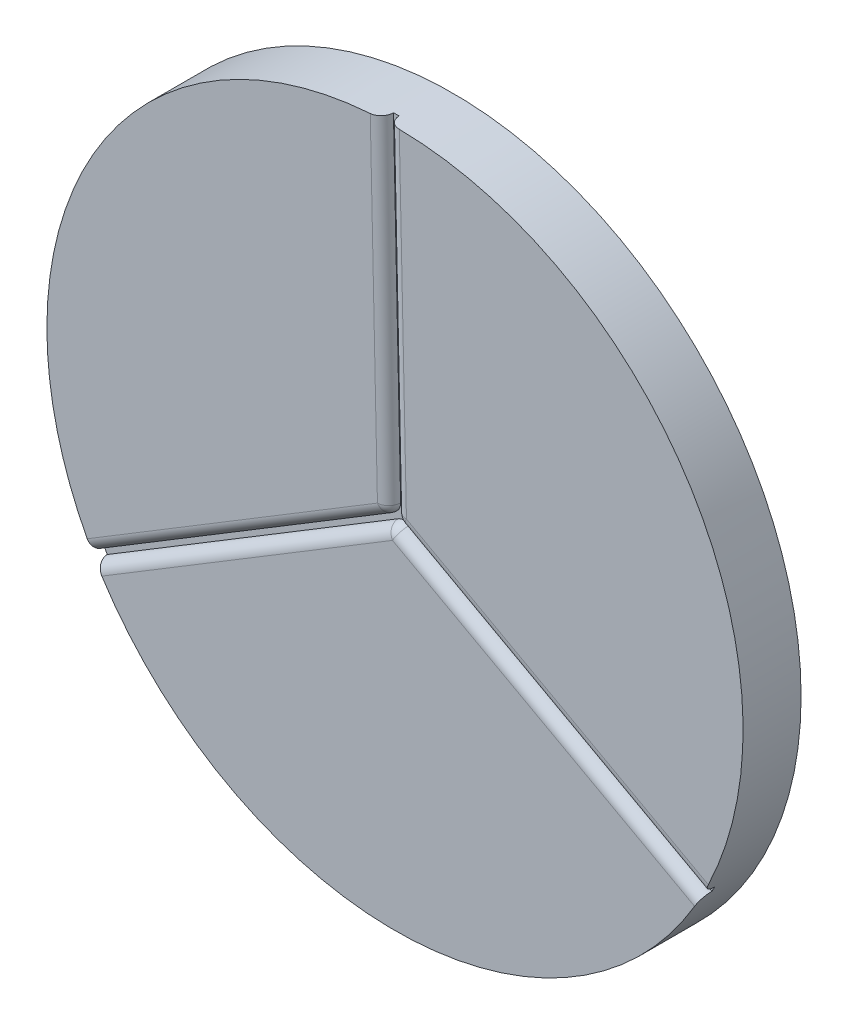
ISO-10303-21;
HEADER;
FILE_DESCRIPTION(('STEP AP214'),'2;1');
FILE_NAME('part.step','',(''),(''),'','','');
FILE_SCHEMA(('AUTOMOTIVE_DESIGN { 1 0 10303 214 1 1 1 1 }'));
ENDSEC;
DATA;
#1=APPLICATION_CONTEXT('core data for automotive mechanical design processes');
#2=APPLICATION_PROTOCOL_DEFINITION('international standard','automotive_design',2000,#1);
#3=PRODUCT_CONTEXT('',#1,'mechanical');
#4=PRODUCT('Part','Part','',(#3));
#5=PRODUCT_RELATED_PRODUCT_CATEGORY('part','',(#4));
#6=PRODUCT_DEFINITION_FORMATION('','',#4);
#7=PRODUCT_DEFINITION_CONTEXT('part definition',#1,'design');
#8=PRODUCT_DEFINITION('design','',#6,#7);
#9=PRODUCT_DEFINITION_SHAPE('','',#8);
#10=(LENGTH_UNIT() NAMED_UNIT(*) SI_UNIT(.MILLI.,.METRE.));
#11=(NAMED_UNIT(*) PLANE_ANGLE_UNIT() SI_UNIT($,.RADIAN.));
#12=(NAMED_UNIT(*) SI_UNIT($,.STERADIAN.) SOLID_ANGLE_UNIT());
#13=UNCERTAINTY_MEASURE_WITH_UNIT(LENGTH_MEASURE(1.E-05),#10,'distance_accuracy_value','');
#14=(GEOMETRIC_REPRESENTATION_CONTEXT(3) GLOBAL_UNCERTAINTY_ASSIGNED_CONTEXT((#13)) GLOBAL_UNIT_ASSIGNED_CONTEXT((#10,
#11,#12)) REPRESENTATION_CONTEXT('',''));
#15=CARTESIAN_POINT('',(0.,0.,0.));
#16=DIRECTION('',(0.,0.,1.));
#17=DIRECTION('',(1.,0.,0.));
#18=AXIS2_PLACEMENT_3D('',#15,#16,#17);
#19=CARTESIAN_POINT('',(0.0986919220805735,0.120916949838355,-0.10000000000011));
#20=DIRECTION('',(-0.740494050701835,-0.449075228525471,0.499999999999984));
#21=DIRECTION('',(-0.51854740815047,0.85504887901244,1.36055056110251E-12));
#22=AXIS2_PLACEMENT_3D('',#19,#20,#21);
#23=SPHERICAL_SURFACE('',#22,0.099999999999712);
#24=CARTESIAN_POINT('',(0.0986919220811878,0.120916949838977,-0.1));
#25=DIRECTION('',(0.876599668029982,-0.48122034662899,0.));
#26=DIRECTION('',(0.48122034662899,0.876599668029982,0.));
#27=AXIS2_PLACEMENT_3D('',#24,#25,#26);
#28=CIRCLE('',#27,0.1);
#29=CARTESIAN_POINT('',(0.0986919220808006,0.120916949838692,0.));
#30=VERTEX_POINT('',#29);
#31=CARTESIAN_POINT('',(0.0505698874181294,0.0332569830359395,-0.1));
#32=VERTEX_POINT('',#31);
#33=EDGE_CURVE('E196',#30,#32,#28,.T.);
#34=ORIENTED_EDGE('',*,*,#33,.F.);
#35=CARTESIAN_POINT('',(0.0986919220810042,0.120916949838391,-0.1));
#36=DIRECTION('',(0.0215507890165499,-0.99976775477746,0.));
#37=DIRECTION('',(0.99976775477746,0.0215507890165499,0.));
#38=AXIS2_PLACEMENT_3D('',#35,#36,#37);
#39=CIRCLE('',#38,0.1);
#40=CARTESIAN_POINT('',(-0.00128485339675898,0.118761870936873,-0.1));
#41=VERTEX_POINT('',#40);
#42=EDGE_CURVE('E211',#41,#30,#39,.F.);
#43=ORIENTED_EDGE('',*,*,#42,.F.);
#44=CARTESIAN_POINT('',(0.0986919220805905,0.120916949838391,-0.1));
#45=DIRECTION('',(0.,0.,-1.));
#46=DIRECTION('',(-1.,0.,0.));
#47=AXIS2_PLACEMENT_3D('',#44,#45,#46);
#48=CIRCLE('',#47,0.0999999999996432);
#49=EDGE_CURVE('E108',#41,#32,#48,.F.);
#50=ORIENTED_EDGE('',*,*,#49,.T.);
#51=EDGE_LOOP('',(#34,#43,#50));
#52=FACE_BOUND('',#51,.T.);
#53=ADVANCED_FACE('F17',(#52),#23,.T.);
#54=CARTESIAN_POINT('',(-0.151250016613774,0.1155292525847,-0.0999999999977621));
#55=DIRECTION('',(0.759157581463014,-0.416749044998505,0.500000000000061));
#56=DIRECTION('',(0.481220346628832,0.876599668030069,0.));
#57=AXIS2_PLACEMENT_3D('',#54,#55,#56);
#58=SPHERICAL_SURFACE('',#57,0.0999999999993052);
#59=CARTESIAN_POINT('',(-0.151250016613774,0.1155292525847,-0.1));
#60=DIRECTION('',(0.,0.,-1.));
#61=DIRECTION('',(-1.,0.,0.));
#62=AXIS2_PLACEMENT_3D('',#59,#60,#61);
#63=CIRCLE('',#62,0.0999999999993052);
#64=CARTESIAN_POINT('',(-0.0993952757986833,0.0300243646831851,-0.1));
#65=VERTEX_POINT('',#64);
#66=CARTESIAN_POINT('',(-0.0512732411361401,0.117684331486303,-0.1));
#67=VERTEX_POINT('',#66);
#68=EDGE_CURVE('E197',#65,#67,#63,.F.);
#69=ORIENTED_EDGE('',*,*,#68,.T.);
#70=CARTESIAN_POINT('',(-0.151250016613691,0.115529252584603,-0.1));
#71=DIRECTION('',(-0.0215507890165499,0.99976775477746,0.));
#72=DIRECTION('',(-0.99976775477746,-0.0215507890165499,0.));
#73=AXIS2_PLACEMENT_3D('',#70,#71,#72);
#74=CIRCLE('',#73,0.1);
#75=CARTESIAN_POINT('',(-0.15125001661289,0.115529252584002,0.));
#76=VERTEX_POINT('',#75);
#77=EDGE_CURVE('E114',#76,#67,#74,.T.);
#78=ORIENTED_EDGE('',*,*,#77,.F.);
#79=CARTESIAN_POINT('',(-0.151250016613059,0.115529252584466,-0.1));
#80=DIRECTION('',(0.855048879013511,0.518547408148704,0.));
#81=DIRECTION('',(-0.518547408148704,0.855048879013511,0.));
#82=AXIS2_PLACEMENT_3D('',#79,#80,#81);
#83=CIRCLE('',#82,0.1);
#84=EDGE_CURVE('E173',#65,#76,#83,.F.);
#85=ORIENTED_EDGE('',*,*,#84,.F.);
#86=EDGE_LOOP('',(#69,#78,#85));
#87=FACE_BOUND('',#86,.T.);
#88=ADVANCED_FACE('F368',(#87),#58,.T.);
#89=CARTESIAN_POINT('',(-0.0216131645762324,-0.0982329671689023,-0.0999999999999817));
#90=DIRECTION('',(-0.0186635307598088,0.865824273521791,0.50000000000004));
#91=DIRECTION('',(0.,0.500087104601494,-0.865975108078341));
#92=AXIS2_PLACEMENT_3D('',#89,#90,#91);
#93=SPHERICAL_SURFACE('',#92,0.0999999999999867);
#94=CARTESIAN_POINT('',(-0.021613164576264,-0.0982329671689126,-0.1));
#95=DIRECTION('',(-0.876599668029982,0.48122034662899,0.));
#96=DIRECTION('',(-0.48122034662899,-0.876599668029982,0.));
#97=AXIS2_PLACEMENT_3D('',#94,#95,#96);
#98=CIRCLE('',#97,0.1);
#99=CARTESIAN_POINT('',(0.0265088700866463,-0.0105730003659174,-0.1));
#100=VERTEX_POINT('',#99);
#101=CARTESIAN_POINT('',(-0.0216131645762405,-0.0982329671688943,0.));
#102=VERTEX_POINT('',#101);
#103=EDGE_CURVE('E225',#100,#102,#98,.F.);
#104=ORIENTED_EDGE('',*,*,#103,.F.);
#105=CARTESIAN_POINT('',(-0.0216131645762332,-0.0982329671674132,-0.1));
#106=DIRECTION('',(0.,0.,-1.));
#107=DIRECTION('',(-1.,0.,0.));
#108=AXIS2_PLACEMENT_3D('',#105,#106,#107);
#109=CIRCLE('',#108,0.0999999999985925);
#110=CARTESIAN_POINT('',(-0.0734679053907543,-0.0127280792673807,-0.1));
#111=VERTEX_POINT('',#110);
#112=EDGE_CURVE('E202',#100,#111,#109,.F.);
#113=ORIENTED_EDGE('',*,*,#112,.T.);
#114=CARTESIAN_POINT('',(-0.0216131645762303,-0.0982329671689033,-0.1));
#115=DIRECTION('',(-0.855048879013511,-0.518547408148704,0.));
#116=DIRECTION('',(0.518547408148704,-0.855048879013511,0.));
#117=AXIS2_PLACEMENT_3D('',#114,#115,#116);
#118=CIRCLE('',#117,0.1);
#119=CARTESIAN_POINT('',(-0.022572066097054,-0.09665180475718,-1.7099295421328E-05));
#120=VERTEX_POINT('',#119);
#121=EDGE_CURVE('E226',#120,#111,#118,.T.);
#122=ORIENTED_EDGE('',*,*,#121,.F.);
#123=CARTESIAN_POINT('',(-0.02257206609705,-0.09665180475718,-1.70992954187942E-05));
#124=CARTESIAN_POINT('',(-0.0225324741709384,-0.0967178015003826,-1.56758885320444E-05));
#125=CARTESIAN_POINT('',(-0.0224928414227235,-0.0967837756700245,-1.43413394965335E-05));
#126=CARTESIAN_POINT('',(-0.0224134829933346,-0.096915698332326,-1.18495925876258E-05));
#127=CARTESIAN_POINT('',(-0.0223737572879055,-0.0969816468113991,-1.0692447891005E-05));
#128=CARTESIAN_POINT('',(-0.0222942134813897,-0.0971135177426256,-8.5556781210288E-06));
#129=CARTESIAN_POINT('',(-0.0222543953562738,-0.0971794401811443,-7.57610611152642E-06));
#130=CARTESIAN_POINT('',(-0.0221746672486566,-0.0973112586823564,-5.79464816125889E-06));
#131=CARTESIAN_POINT('',(-0.0221347572423515,-0.0973771547313679,-4.9928151701028E-06));
#132=CARTESIAN_POINT('',(-0.022054845911714,-0.097508920105245,-3.56700010867671E-06));
#133=CARTESIAN_POINT('',(-0.0220148445638028,-0.0975747894163824,-2.94307087258325E-06));
#134=CARTESIAN_POINT('',(-0.0219347510903505,-0.0977065009669271,-1.87322643619591E-06));
#135=CARTESIAN_POINT('',(-0.021894658941455,-0.0977723431925609,-1.42736395342074E-06));
#136=CARTESIAN_POINT('',(-0.0218143844075068,-0.0979040002251057,-7.13814538407674E-07));
#137=CARTESIAN_POINT('',(-0.0217742019993238,-0.0979698150181987,-4.46180205851998E-07));
#138=CARTESIAN_POINT('',(-0.0216937474892144,-0.0981014168397054,-8.92465855030508E-08));
#139=CARTESIAN_POINT('',(-0.0216534753643813,-0.0981672038542575,2.21740714199639E-13));
#140=CARTESIAN_POINT('',(-0.02161316457623,-0.0982329671689,0.));
#141=B_SPLINE_CURVE_WITH_KNOTS('',3,(#123,#124,#125,#126,#127,#128,#129,#130,#131,#132,#133,
#134,#135,#136,#137,#138,#139,#140),.UNSPECIFIED.,.F.,.F.,(4,2,2,2,2,2,2,2,4),(0.,
0.00023092427501331,0.000461917634582881,0.000692979908263935,0.000924110924663335,
0.00115531051144277,0.00138657849532195,0.00161791470208165,0.00184931895656703),.UNSPECIFIED.);
#142=EDGE_CURVE('E123',#102,#120,#141,.F.);
#143=ORIENTED_EDGE('',*,*,#142,.F.);
#144=EDGE_LOOP('',(#104,#113,#122,#143));
#145=FACE_BOUND('',#144,.T.);
#146=ADVANCED_FACE('F19',(#145),#93,.T.);
#147=CARTESIAN_POINT('',(-0.02472375303623,0.04607107841808,-0.1));
#148=DIRECTION('',(0.,0.,-1.));
#149=DIRECTION('',(-1.,0.,0.));
#150=AXIS2_PLACEMENT_3D('',#147,#148,#149);
#151=PLANE('',#150);
#152=ORIENTED_EDGE('',*,*,#68,.F.);
#153=DIRECTION('',(0.855048879013511,0.518547408148704,0.));
#154=VECTOR('',#153,1.);
#155=CARTESIAN_POINT('',(-1.75513168120313,-0.974102817602351,-0.1));
#156=LINE('',#155,#154);
#157=CARTESIAN_POINT('',(-2.60433571490408,-1.48910559869844,-0.1));
#158=VERTEX_POINT('',#157);
#159=EDGE_CURVE('E172',#158,#65,#156,.T.);
#160=ORIENTED_EDGE('',*,*,#159,.F.);
#161=CARTESIAN_POINT('',(0.,0.,-0.1));
#162=DIRECTION('',(0.,0.,-1.));
#163=DIRECTION('',(-1.,0.,0.));
#164=AXIS2_PLACEMENT_3D('',#161,#162,#163);
#165=CIRCLE('',#164,3.);
#166=CARTESIAN_POINT('',(-2.57915256744653,-1.53230937928148,-0.1));
#167=VERTEX_POINT('',#166);
#168=EDGE_CURVE('E199',#167,#158,#165,.T.);
#169=ORIENTED_EDGE('',*,*,#168,.F.);
#170=DIRECTION('',(-0.855048879013511,-0.518547408148704,0.));
#171=VECTOR('',#170,1.);
#172=CARTESIAN_POINT('',(-0.0191065527689004,0.0202395547444611,-0.1));
#173=LINE('',#172,#171);
#174=EDGE_CURVE('E223',#111,#167,#173,.T.);
#175=ORIENTED_EDGE('',*,*,#174,.F.);
#176=ORIENTED_EDGE('',*,*,#112,.F.);
#177=DIRECTION('',(-0.876599668029982,0.48122034662899,0.));
#178=VECTOR('',#177,1.);
#179=CARTESIAN_POINT('',(1.7419878434369,-0.952306628951002,-0.1));
#180=LINE('',#179,#178);
#181=CARTESIAN_POINT('',(2.63147587638926,-1.44060220462881,-0.1));
#182=VERTEX_POINT('',#181);
#183=EDGE_CURVE('E219',#182,#100,#180,.T.);
#184=ORIENTED_EDGE('',*,*,#183,.F.);
#185=CARTESIAN_POINT('',(0.,0.,-0.1));
#186=DIRECTION('',(0.,0.,-1.));
#187=DIRECTION('',(-1.,0.,0.));
#188=AXIS2_PLACEMENT_3D('',#185,#186,#187);
#189=CIRCLE('',#188,3.);
#190=CARTESIAN_POINT('',(2.65512064631391,-1.3965437170091,-0.1));
#191=VERTEX_POINT('',#190);
#192=EDGE_CURVE('E205',#191,#182,#189,.T.);
#193=ORIENTED_EDGE('',*,*,#192,.F.);
#194=DIRECTION('',(0.876599668029982,-0.48122034662899,0.));
#195=VECTOR('',#194,1.);
#196=CARTESIAN_POINT('',(0.012849524708351,0.0539640477090018,-0.1));
#197=LINE('',#196,#195);
#198=EDGE_CURVE('E213',#32,#191,#197,.T.);
#199=ORIENTED_EDGE('',*,*,#198,.F.);
#200=ORIENTED_EDGE('',*,*,#49,.F.);
#201=DIRECTION('',(0.0215507890165499,-0.99976775477746,0.));
#202=VECTOR('',#201,1.);
#203=CARTESIAN_POINT('',(-0.042484606565156,2.03006937299334,-0.1));
#204=LINE('',#203,#202);
#205=CARTESIAN_POINT('',(-0.0633778002634067,2.99933046769338,-0.1));
#206=VERTEX_POINT('',#205);
#207=EDGE_CURVE('E105',#206,#41,#204,.T.);
#208=ORIENTED_EDGE('',*,*,#207,.F.);
#209=CARTESIAN_POINT('',(0.,0.,-0.1));
#210=DIRECTION('',(0.,0.,-1.));
#211=DIRECTION('',(-1.,0.,0.));
#212=AXIS2_PLACEMENT_3D('',#209,#210,#211);
#213=CIRCLE('',#212,3.);
#214=CARTESIAN_POINT('',(-0.113357665847649,2.99785757493474,-0.1));
#215=VERTEX_POINT('',#214);
#216=EDGE_CURVE('E22',#215,#206,#213,.T.);
#217=ORIENTED_EDGE('',*,*,#216,.F.);
#218=DIRECTION('',(-0.0215507890165499,0.99976775477746,0.));
#219=VECTOR('',#218,1.);
#220=CARTESIAN_POINT('',(-0.049371416271254,0.029456323987685,-0.1));
#221=LINE('',#220,#219);
#222=EDGE_CURVE('E102',#67,#215,#221,.T.);
#223=ORIENTED_EDGE('',*,*,#222,.F.);
#224=EDGE_LOOP('',(#152,#160,#169,#175,#176,#184,#193,#199,#200,#208,#217,#223));
#225=FACE_BOUND('',#224,.T.);
#226=ADVANCED_FACE('F101',(#225),#151,.F.);
#227=CARTESIAN_POINT('',(0.06097155937125,0.141624014512,-0.1));
#228=DIRECTION('',(0.876599668029982,-0.48122034662899,0.));
#229=DIRECTION('',(0.48122034662899,0.876599668029982,0.));
#230=AXIS2_PLACEMENT_3D('',#227,#228,#229);
#231=CYLINDRICAL_SURFACE('',#230,0.1);
#232=ORIENTED_EDGE('',*,*,#33,.T.);
#233=ORIENTED_EDGE('',*,*,#198,.T.);
#234=CARTESIAN_POINT('',(2.65512064631391,-1.3965437170091,-0.1));
#235=CARTESIAN_POINT('',(2.65511802470164,-1.39654773374874,-0.0943752455772245));
#236=CARTESIAN_POINT('',(2.65534146014883,-1.39612388819054,-0.0887519140747782));
#237=CARTESIAN_POINT('',(2.65622109822432,-1.39445010147058,-0.0776686027403452));
#238=CARTESIAN_POINT('',(2.6568769624613,-1.39320080625166,-0.0722084986665562));
#239=CARTESIAN_POINT('',(2.658602582535,-1.38990487023874,-0.0616003112229772));
#240=CARTESIAN_POINT('',(2.6596725377337,-1.38785784537858,-0.0564523795299604));
#241=CARTESIAN_POINT('',(2.66218959849441,-1.38302349520236,-0.0466182089328773));
#242=CARTESIAN_POINT('',(2.66363663734845,-1.38023630082432,-0.0419318885693229));
#243=CARTESIAN_POINT('',(2.66686037902004,-1.37399708770566,-0.0331532661729653));
#244=CARTESIAN_POINT('',(2.66863706074322,-1.37054511150494,-0.0290609261602699));
#245=CARTESIAN_POINT('',(2.67246293513859,-1.3630698639407,-0.0215852087235849));
#246=CARTESIAN_POINT('',(2.67451217938009,-1.35904648445684,-0.0182019657748552));
#247=CARTESIAN_POINT('',(2.6788179497648,-1.35053955927412,-0.0122407022911144));
#248=CARTESIAN_POINT('',(2.68107451705553,-1.34605592220684,-0.00966284204960548));
#249=CARTESIAN_POINT('',(2.68572435893799,-1.33675413905392,-0.00538683012123936));
#250=CARTESIAN_POINT('',(2.68811755532384,-1.33193618399679,-0.00368818067374716));
#251=CARTESIAN_POINT('',(2.69214112914409,-1.32377839678398,-0.00163730582094274));
#252=CARTESIAN_POINT('',(2.69375405546065,-1.32049328301047,-0.00102362565108948));
#253=CARTESIAN_POINT('',(2.69698538349973,-1.31388108311097,-0.000205025275146878));
#254=CARTESIAN_POINT('',(2.69860377406333,-1.31055406388003,4.79445455440571E-07));
#255=CARTESIAN_POINT('',(2.70021653129323,-1.30722250750623,4.66312231779203E-13));
#256=B_SPLINE_CURVE_WITH_KNOTS('',3,(#234,#235,#236,#237,#238,#239,#240,#241,#242,#243,#244,
#245,#246,#247,#248,#249,#250,#251,#252,#253,#254,#255),.UNSPECIFIED.,.F.,.F.,(4,2,2,2,2,2,2,2,
2,2,4),(0.,0.016851854949335,0.0336905383338307,0.0505373387216082,0.0673811608471759,
0.0842239054814811,0.101069841339244,0.117919127872845,0.134758864807441,0.145870052992108,
0.156965318252502),.UNSPECIFIED.);
#257=CARTESIAN_POINT('',(2.70021653129326,-1.30722250750613,0.));
#258=VERTEX_POINT('',#257);
#259=EDGE_CURVE('E189',#191,#258,#256,.T.);
#260=ORIENTED_EDGE('',*,*,#259,.T.);
#261=DIRECTION('',(0.876599668029936,-0.481220346629074,0.));
#262=VECTOR('',#261,1.);
#263=CARTESIAN_POINT('',(0.09869192208097,0.120916949839,0.));
#264=LINE('',#263,#262);
#265=EDGE_CURVE('E222',#30,#258,#264,.T.);
#266=ORIENTED_EDGE('',*,*,#265,.F.);
#267=EDGE_LOOP('',(#232,#233,#260,#266));
#268=FACE_BOUND('',#267,.T.);
#269=ADVANCED_FACE('F182',(#268),#231,.T.);
#270=CARTESIAN_POINT('',(0.05749216891259,2.032224451895,-0.1));
#271=DIRECTION('',(0.0215507890165499,-0.99976775477746,0.));
#272=DIRECTION('',(0.99976775477746,0.0215507890165499,0.));
#273=AXIS2_PLACEMENT_3D('',#270,#271,#272);
#274=CYLINDRICAL_SURFACE('',#273,0.1);
#275=CARTESIAN_POINT('',(0.0366358195036641,2.99977629444752,0.));
#276=CARTESIAN_POINT('',(0.0310106491385487,2.99984560375445,4.79865691325998E-06));
#277=CARTESIAN_POINT('',(0.0253866298435473,2.99989787136186,-0.000473882831298569));
#278=CARTESIAN_POINT('',(0.0143014992458408,2.99997086504123,-0.00236341894327308));
#279=CARTESIAN_POINT('',(0.00884026507065487,2.99999161552583,-0.003773550865233));
#280=CARTESIAN_POINT('',(-0.00177053648019988,3.00000421940886,-0.00749222597376298));
#281=CARTESIAN_POINT('',(-0.00691994713163504,2.99999605839682,-0.00980121667133648));
#282=CARTESIAN_POINT('',(-0.0167570751030012,2.99995722465642,-0.0152502301967179));
#283=CARTESIAN_POINT('',(-0.0214448762767246,2.99992655602526,-0.0183901017071149));
#284=CARTESIAN_POINT('',(-0.0302252466480064,2.99985095637996,-0.0254112518996798));
#285=CARTESIAN_POINT('',(-0.0343180012580711,2.99980602982244,-0.0292922987608));
#286=CARTESIAN_POINT('',(-0.0417947281748877,2.99971118845743,-0.0376872253827766));
#287=CARTESIAN_POINT('',(-0.0451785601085663,2.9996612726649,-0.0422012301801807));
#288=CARTESIAN_POINT('',(-0.0511413425225816,2.99956555054991,-0.0517342325044178));
#289=CARTESIAN_POINT('',(-0.0537200396041966,2.99951974552444,-0.056753388360685));
#290=CARTESIAN_POINT('',(-0.0579970841312135,2.99944010471301,-0.0671524202737085));
#291=CARTESIAN_POINT('',(-0.0596959448682657,2.99940626195199,-0.0725320839384401));
#292=CARTESIAN_POINT('',(-0.0617442810283694,2.9993646498506,-0.0816203842742485));
#293=CARTESIAN_POINT('',(-0.0623564781474754,2.9993519227621,-0.0852719529877125));
#294=CARTESIAN_POINT('',(-0.0631731860729599,2.99933479221699,-0.092615171629124));
#295=CARTESIAN_POINT('',(-0.0633782729506153,2.99933037699934,-0.0963067574786154));
#296=CARTESIAN_POINT('',(-0.0633778002638975,2.99933046769368,-0.0999999999998908));
#297=B_SPLINE_CURVE_WITH_KNOTS('',3,(#275,#276,#277,#278,#279,#280,#281,#282,#283,#284,#285,
#286,#287,#288,#289,#290,#291,#292,#293,#294,#295,#296),.UNSPECIFIED.,.F.,.F.,(4,2,2,2,2,2,2,2,
2,2,4),(0.,0.0168544888780291,0.0336959158864363,0.0505457384102119,0.0673924944064493,
0.0842339897646983,0.101078816745427,0.117928939938263,0.134769221757571,0.145855730836174,
0.156926541009705),.UNSPECIFIED.);
#298=CARTESIAN_POINT('',(0.0366358195036722,2.99977629444752,0.));
#299=VERTEX_POINT('',#298);
#300=EDGE_CURVE('E152',#299,#206,#297,.T.);
#301=ORIENTED_EDGE('',*,*,#300,.T.);
#302=ORIENTED_EDGE('',*,*,#207,.T.);
#303=ORIENTED_EDGE('',*,*,#42,.T.);
#304=DIRECTION('',(0.0215507890165344,-0.999767754777461,0.));
#305=VECTOR('',#304,1.);
#306=CARTESIAN_POINT('',(0.03663581950367,2.999776294448,0.));
#307=LINE('',#306,#305);
#308=EDGE_CURVE('E254',#299,#30,#307,.T.);
#309=ORIENTED_EDGE('',*,*,#308,.F.);
#310=EDGE_LOOP('',(#301,#302,#303,#309));
#311=FACE_BOUND('',#310,.T.);
#312=ADVANCED_FACE('F177',(#311),#274,.T.);
#313=CARTESIAN_POINT('',(-1.806986422018,-0.888597929701,-0.1));
#314=DIRECTION('',(0.855048879013511,0.518547408148704,0.));
#315=DIRECTION('',(-0.518547408148704,0.855048879013511,0.));
#316=AXIS2_PLACEMENT_3D('',#313,#314,#315);
#317=CYLINDRICAL_SURFACE('',#316,0.1);
#318=ORIENTED_EDGE('',*,*,#84,.T.);
#319=DIRECTION('',(0.855048879013606,0.518547408148546,0.));
#320=VECTOR('',#319,1.);
#321=CARTESIAN_POINT('',(-2.65256089458,-1.401399550644,0.));
#322=LINE('',#321,#320);
#323=CARTESIAN_POINT('',(-2.65256089457994,-1.40139955064403,0.));
#324=VERTEX_POINT('',#323);
#325=EDGE_CURVE('E251',#324,#76,#322,.T.);
#326=ORIENTED_EDGE('',*,*,#325,.F.);
#327=CARTESIAN_POINT('',(-2.65256089457996,-1.40139955064398,0.));
#328=CARTESIAN_POINT('',(-2.64992964070454,-1.40638128270134,4.79434157826769E-06));
#329=CARTESIAN_POINT('',(-2.64728387441554,-1.41135392589735,-0.000474171720530606));
#330=CARTESIAN_POINT('',(-2.64204233740818,-1.42114112731756,-0.00236540338850514));
#331=CARTESIAN_POINT('',(-2.63944653165057,-1.4259557981383,-0.0037769883938417));
#332=CARTESIAN_POINT('',(-2.6343785408847,-1.43529726732306,-0.00750030820473932));
#333=CARTESIAN_POINT('',(-2.63190642170861,-1.43982391272669,-0.00981251673473693));
#334=CARTESIAN_POINT('',(-2.62716356873398,-1.44845980530253,-0.0152699958813746));
#335=CARTESIAN_POINT('',(-2.62489279496211,-1.45256913534849,-0.0184151006456787));
#336=CARTESIAN_POINT('',(-2.62062580190897,-1.46025331886573,-0.0254458800411229));
#337=CARTESIAN_POINT('',(-2.61862927466424,-1.46382877224997,-0.0293307121016241));
#338=CARTESIAN_POINT('',(-2.61497120660267,-1.4703535674319,-0.0377340142489692));
#339=CARTESIAN_POINT('',(-2.61330973230235,-1.47330278491201,-0.0422526098526721));
#340=CARTESIAN_POINT('',(-2.61037703721018,-1.47849269140207,-0.0517915204433558));
#341=CARTESIAN_POINT('',(-2.60910563094228,-1.48073371717011,-0.0568115954685329));
#342=CARTESIAN_POINT('',(-2.60699427156565,-1.48444786370362,-0.0672120893025062));
#343=CARTESIAN_POINT('',(-2.60615406418279,-1.48592143703656,-0.0725922936252349));
#344=CARTESIAN_POINT('',(-2.60514218400492,-1.48769447560667,-0.081671263859424));
#345=CARTESIAN_POINT('',(-2.60484001150802,-1.48822336970959,-0.0853128689911774));
#346=CARTESIAN_POINT('',(-2.60443676951936,-1.4889288635,-0.0926358068736455));
#347=CARTESIAN_POINT('',(-2.6043354147411,-1.48910596295638,-0.0963170757858021));
#348=CARTESIAN_POINT('',(-2.60433571490411,-1.48910559869903,-0.0999999999998892));
#349=B_SPLINE_CURVE_WITH_KNOTS('',3,(#327,#328,#329,#330,#331,#332,#333,#334,#335,#336,#337,
#338,#339,#340,#341,#342,#343,#344,#345,#346,#347,#348),.UNSPECIFIED.,.F.,.F.,(4,2,2,2,2,2,2,2,
2,2,4),(0.,0.0168796420617487,0.0337469793954125,0.0506232008894503,0.0674960643914928,
0.0843498229526268,0.101206924126056,0.118055997336034,0.134895123348197,0.145950741304351,
0.156990642089438),.UNSPECIFIED.);
#350=EDGE_CURVE('E168',#324,#158,#349,.T.);
#351=ORIENTED_EDGE('',*,*,#350,.T.);
#352=ORIENTED_EDGE('',*,*,#159,.T.);
#353=EDGE_LOOP('',(#318,#326,#351,#352));
#354=FACE_BOUND('',#353,.T.);
#355=ADVANCED_FACE('F174',(#354),#317,.T.);
#356=CARTESIAN_POINT('',(-0.149348191749,0.02730124508603,-0.1));
#357=DIRECTION('',(-0.0215507890165499,0.99976775477746,0.));
#358=DIRECTION('',(-0.99976775477746,-0.0215507890165499,0.));
#359=AXIS2_PLACEMENT_3D('',#356,#357,#358);
#360=CYLINDRICAL_SURFACE('',#359,0.1);
#361=CARTESIAN_POINT('',(-0.113357665847649,2.99785757493474,-0.1));
#362=CARTESIAN_POINT('',(-0.11335287692843,2.99785730529223,-0.0943751027982117));
#363=CARTESIAN_POINT('',(-0.113831695551701,2.99783964318584,-0.0887516284309878));
#364=CARTESIAN_POINT('',(-0.115721218430931,2.99776753732278,-0.0776680332292184));
#365=CARTESIAN_POINT('',(-0.117131194328791,2.99771312231374,-0.0722077882020166));
#366=CARTESIAN_POINT('',(-0.120848699280796,2.9975654842253,-0.0615993261414885));
#367=CARTESIAN_POINT('',(-0.123156660699686,2.99747224244994,-0.0564512607995847));
#368=CARTESIAN_POINT('',(-0.128602371034332,2.99724354652106,-0.0466168365689779));
#369=CARTESIAN_POINT('',(-0.131739973161798,2.99710809983409,-0.0419303962061134));
#370=CARTESIAN_POINT('',(-0.138755850078216,2.99679146635959,-0.033151581070955));
#371=CARTESIAN_POINT('',(-0.142634073749367,2.99661028272855,-0.0290591653332905));
#372=CARTESIAN_POINT('',(-0.151021641273044,2.99619926881103,-0.0215833347334));
#373=CARTESIAN_POINT('',(-0.15553110463246,2.99596942930875,-0.0182000544289647));
#374=CARTESIAN_POINT('',(-0.165052156117775,2.99545998051658,-0.0122388767783451));
#375=CARTESIAN_POINT('',(-0.170063828950828,2.99518036282445,-0.00966111560123515));
#376=CARTESIAN_POINT('',(-0.180445298489939,2.99457283340563,-0.00538536247349747));
#377=CARTESIAN_POINT('',(-0.185814890150773,2.99424494920203,-0.00368687161191038));
#378=CARTESIAN_POINT('',(-0.194891396327335,2.99366505125599,-0.00163657495596165));
#379=CARTESIAN_POINT('',(-0.198542158118634,2.99342519955926,-0.00102317092647592));
#380=CARTESIAN_POINT('',(-0.205882771387883,2.99292932352362,-0.000204935965315081));
#381=CARTESIAN_POINT('',(-0.209572559385802,2.99267332284167,4.78926894502302E-07));
#382=CARTESIAN_POINT('',(-0.213263472855925,2.99241018096542,4.65882102616964E-13));
#383=B_SPLINE_CURVE_WITH_KNOTS('',3,(#361,#362,#363,#364,#365,#366,#367,#368,#369,#370,#371,
#372,#373,#374,#375,#376,#377,#378,#379,#380,#381,#382),.UNSPECIFIED.,.F.,.F.,(4,2,2,2,2,2,2,2,
2,2,4),(0.,0.0168522830015714,0.0336913996113307,0.050538634022422,0.0673828896453811,
0.0842259830954003,0.101072269619274,0.11792140238698,0.134760964199967,0.14586883063469,
0.156960786735115),.UNSPECIFIED.);
#384=CARTESIAN_POINT('',(-0.213263472856019,2.9924101809654,0.));
#385=VERTEX_POINT('',#384);
#386=EDGE_CURVE('E112',#215,#385,#383,.T.);
#387=ORIENTED_EDGE('',*,*,#386,.T.);
#388=DIRECTION('',(-0.0215507890168206,0.999767754777454,0.));
#389=VECTOR('',#388,1.);
#390=CARTESIAN_POINT('',(-0.151250016613,0.115529252584,0.));
#391=LINE('',#390,#389);
#392=EDGE_CURVE('E247',#76,#385,#391,.T.);
#393=ORIENTED_EDGE('',*,*,#392,.F.);
#394=ORIENTED_EDGE('',*,*,#77,.T.);
#395=ORIENTED_EDGE('',*,*,#222,.T.);
#396=EDGE_LOOP('',(#387,#393,#394,#395));
#397=FACE_BOUND('',#396,.T.);
#398=ADVANCED_FACE('F110',(#397),#360,.T.);
#399=CARTESIAN_POINT('',(0.03274818804597,-0.06526533315689,-0.1));
#400=DIRECTION('',(-0.855048879013511,-0.518547408148704,0.));
#401=DIRECTION('',(0.518547408148704,-0.855048879013511,0.));
#402=AXIS2_PLACEMENT_3D('',#399,#400,#401);
#403=CYLINDRICAL_SURFACE('',#402,0.1);
#404=ORIENTED_EDGE('',*,*,#121,.T.);
#405=ORIENTED_EDGE('',*,*,#174,.T.);
#406=CARTESIAN_POINT('',(-2.57915256744653,-1.53230937928148,-0.1));
#407=CARTESIAN_POINT('',(-2.57915462278608,-1.53230503769582,-0.0943742147121929));
#408=CARTESIAN_POINT('',(-2.57891021344587,-1.5327172904179,-0.0887498623147764));
#409=CARTESIAN_POINT('',(-2.57794362950241,-1.53434293816269,-0.0776645755455246));
#410=CARTESIAN_POINT('',(-2.57722183050843,-1.53555570334224,-0.0722035162229126));
#411=CARTESIAN_POINT('',(-2.57531513100808,-1.53875118764873,-0.0615934929399226));
#412=CARTESIAN_POINT('',(-2.57413000870103,-1.54073427553921,-0.0564446798227458));
#413=CARTESIAN_POINT('',(-2.57132608197668,-1.54540921099946,-0.0466087780412504));
#414=CARTESIAN_POINT('',(-2.56970735327099,-1.54810093483356,-0.0419216089649232));
#415=CARTESIAN_POINT('',(-2.56607556643224,-1.55411340361639,-0.0331410607434953));
#416=CARTESIAN_POINT('',(-2.56406250759802,-1.5574341496836,-0.0290476826542436));
#417=CARTESIAN_POINT('',(-2.55969189288136,-1.56460698450371,-0.0215701738382137));
#418=CARTESIAN_POINT('',(-2.55733427096091,-1.56845917510387,-0.0181861793732813));
#419=CARTESIAN_POINT('',(-2.55233555041579,-1.57658046161165,-0.0122246075435107));
#420=CARTESIAN_POINT('',(-2.54969444832574,-1.58084956261569,-0.00964704003826971));
#421=CARTESIAN_POINT('',(-2.54419858825088,-1.5896793730806,-0.00537246825173841));
#422=CARTESIAN_POINT('',(-2.54134395583585,-1.59423991093121,-0.00367495102989225));
#423=CARTESIAN_POINT('',(-2.53650187923136,-1.60192735094988,-0.00162978153702629));
#424=CARTESIAN_POINT('',(-2.53455212267223,-1.60501055255993,-0.00101895859403334));
#425=CARTESIAN_POINT('',(-2.53061989345184,-1.6112034401219,-0.000204119247510855));
#426=CARTESIAN_POINT('',(-2.52863747121257,-1.61431308221811,4.73945828533515E-07));
#427=CARTESIAN_POINT('',(-2.52664826420431,-1.61742033775807,4.67067958048902E-13));
#428=B_SPLINE_CURVE_WITH_KNOTS('',3,(#406,#407,#408,#409,#410,#411,#412,#413,#414,#415,#416,
#417,#418,#419,#420,#421,#422,#423,#424,#425,#426,#427),.UNSPECIFIED.,.F.,.F.,(4,2,2,2,2,2,2,2,
2,2,4),(0.,0.0168549247067317,0.0336966037421518,0.0505463550650829,0.0673931661842805,
0.0842400072592567,0.101090081397941,0.117940361542206,0.134780809365501,0.145855983387109,
0.156915420922987),.UNSPECIFIED.);
#429=CARTESIAN_POINT('',(-2.52664826420424,-1.61742033775815,0.));
#430=VERTEX_POINT('',#429);
#431=EDGE_CURVE('E37',#167,#430,#428,.T.);
#432=ORIENTED_EDGE('',*,*,#431,.T.);
#433=DIRECTION('',(-0.855048879013478,-0.518547408148757,0.));
#434=VECTOR('',#433,1.);
#435=CARTESIAN_POINT('',(-0.02161316457623,-0.0982329671689,0.));
#436=LINE('',#435,#434);
#437=EDGE_CURVE('E242',#102,#430,#436,.T.);
#438=ORIENTED_EDGE('',*,*,#437,.F.);
#439=ORIENTED_EDGE('',*,*,#142,.T.);
#440=EDGE_LOOP('',(#404,#405,#432,#438,#439));
#441=FACE_BOUND('',#440,.T.);
#442=ADVANCED_FACE('F270',(#441),#403,.T.);
#443=CARTESIAN_POINT('',(1.693865808774,-1.039966595754,-0.1));
#444=DIRECTION('',(-0.876599668029982,0.48122034662899,0.));
#445=DIRECTION('',(-0.48122034662899,-0.876599668029982,0.));
#446=AXIS2_PLACEMENT_3D('',#443,#444,#445);
#447=CYLINDRICAL_SURFACE('',#446,0.1);
#448=CARTESIAN_POINT('',(2.58199441864094,-1.52751589913396,0.));
#449=CARTESIAN_POINT('',(2.5848591799495,-1.52267472643136,4.7985254167232E-06));
#450=CARTESIAN_POINT('',(2.58770859401087,-1.51782605999106,-0.000473879463158031));
#451=CARTESIAN_POINT('',(2.59329884915677,-1.50825422240455,-0.00236336979111085));
#452=CARTESIAN_POINT('',(2.59603977290759,-1.50353095664707,-0.00377345734598205));
#453=CARTESIAN_POINT('',(2.60134117428127,-1.49434016968461,-0.0074919708630716));
#454=CARTESIAN_POINT('',(2.60390156155488,-1.48987277673786,-0.00980084290463231));
#455=CARTESIAN_POINT('',(2.60877263948555,-1.48132692607758,-0.0152495317904564));
#456=CARTESIAN_POINT('',(2.61108337527916,-1.47724839807369,-0.0183891980733325));
#457=CARTESIAN_POINT('',(2.6153958181949,-1.46959995909594,-0.0254099979702775));
#458=CARTESIAN_POINT('',(2.61739760872605,-1.46602991086291,-0.0292909308218862));
#459=CARTESIAN_POINT('',(2.62104347055392,-1.45950167483743,-0.0376856070006762));
#460=CARTESIAN_POINT('',(2.62268747103314,-1.45654360818041,-0.042199475314797));
#461=CARTESIAN_POINT('',(2.62557776706133,-1.45132708884765,-0.0517323361298892));
#462=CARTESIAN_POINT('',(2.62682392565402,-1.44906887710339,-0.0567515017980492));
#463=CARTESIAN_POINT('',(2.62888765076371,-1.44532152952896,-0.0671505757174297));
#464=CARTESIAN_POINT('',(2.62970546713702,-1.44383194535816,-0.0725302715972885));
#465=CARTESIAN_POINT('',(2.63069086513278,-1.44203544732739,-0.08161889502775));
#466=CARTESIAN_POINT('',(2.63098513745233,-1.44149835017207,-0.0852707544349381));
#467=CARTESIAN_POINT('',(2.63137758318722,-1.44078175375425,-0.0926145663298049));
#468=CARTESIAN_POINT('',(2.63147603363048,-1.44060174931599,-0.0963064547385047));
#469=CARTESIAN_POINT('',(2.63147587638977,-1.44060220462854,-0.0999999999998911));
#470=B_SPLINE_CURVE_WITH_KNOTS('',3,(#448,#449,#450,#451,#452,#453,#454,#455,#456,#457,#458,
#459,#460,#461,#462,#463,#464,#465,#466,#467,#468,#469),.UNSPECIFIED.,.F.,.F.,(4,2,2,2,2,2,2,2,
2,2,4),(0.,0.016853536985364,0.0336939746692209,0.0505427811767618,0.0673885363338652,
0.0842297354890448,0.101074265002881,0.117924586975396,0.134765069009034,0.145852482177784,
0.156924198868354),.UNSPECIFIED.);
#471=CARTESIAN_POINT('',(2.58199441864094,-1.52751589913396,0.));
#472=VERTEX_POINT('',#471);
#473=EDGE_CURVE('E161',#472,#182,#470,.T.);
#474=ORIENTED_EDGE('',*,*,#473,.T.);
#475=ORIENTED_EDGE('',*,*,#183,.T.);
#476=ORIENTED_EDGE('',*,*,#103,.T.);
#477=DIRECTION('',(-0.876599668030004,0.48122034662895,0.));
#478=VECTOR('',#477,1.);
#479=CARTESIAN_POINT('',(2.581994418641,-1.527515899134,0.));
#480=LINE('',#479,#478);
#481=EDGE_CURVE('E239',#472,#102,#480,.T.);
#482=ORIENTED_EDGE('',*,*,#481,.F.);
#483=EDGE_LOOP('',(#474,#475,#476,#482));
#484=FACE_BOUND('',#483,.T.);
#485=ADVANCED_FACE('F266',(#484),#447,.T.);
#486=CARTESIAN_POINT('',(0.,0.,0.));
#487=DIRECTION('',(0.,0.,1.));
#488=DIRECTION('',(1.,0.,0.));
#489=AXIS2_PLACEMENT_3D('',#486,#487,#488);
#490=PLANE('',#489);
#491=CARTESIAN_POINT('',(0.,0.,0.));
#492=DIRECTION('',(0.,0.,-1.));
#493=DIRECTION('',(-1.,0.,0.));
#494=AXIS2_PLACEMENT_3D('',#491,#492,#493);
#495=CIRCLE('',#494,3.);
#496=EDGE_CURVE('E238',#299,#258,#495,.T.);
#497=ORIENTED_EDGE('',*,*,#496,.F.);
#498=ORIENTED_EDGE('',*,*,#308,.T.);
#499=ORIENTED_EDGE('',*,*,#265,.T.);
#500=EDGE_LOOP('',(#497,#498,#499));
#501=FACE_BOUND('',#500,.T.);
#502=ADVANCED_FACE('F260',(#501),#490,.T.);
#503=CARTESIAN_POINT('',(0.,0.,0.));
#504=DIRECTION('',(0.,0.,1.));
#505=DIRECTION('',(1.,0.,0.));
#506=AXIS2_PLACEMENT_3D('',#503,#504,#505);
#507=PLANE('',#506);
#508=ORIENTED_EDGE('',*,*,#392,.T.);
#509=CARTESIAN_POINT('',(0.,0.,0.));
#510=DIRECTION('',(0.,0.,-1.));
#511=DIRECTION('',(-1.,0.,0.));
#512=AXIS2_PLACEMENT_3D('',#509,#510,#511);
#513=CIRCLE('',#512,3.);
#514=EDGE_CURVE('E121',#324,#385,#513,.T.);
#515=ORIENTED_EDGE('',*,*,#514,.F.);
#516=ORIENTED_EDGE('',*,*,#325,.T.);
#517=EDGE_LOOP('',(#508,#515,#516));
#518=FACE_BOUND('',#517,.T.);
#519=ADVANCED_FACE('F277',(#518),#507,.T.);
#520=CARTESIAN_POINT('',(0.,0.,0.));
#521=DIRECTION('',(0.,0.,1.));
#522=DIRECTION('',(1.,0.,0.));
#523=AXIS2_PLACEMENT_3D('',#520,#521,#522);
#524=PLANE('',#523);
#525=CARTESIAN_POINT('',(0.,0.,0.));
#526=DIRECTION('',(0.,0.,-1.));
#527=DIRECTION('',(-1.,0.,0.));
#528=AXIS2_PLACEMENT_3D('',#525,#526,#527);
#529=CIRCLE('',#528,3.);
#530=EDGE_CURVE('E28',#472,#430,#529,.T.);
#531=ORIENTED_EDGE('',*,*,#530,.F.);
#532=ORIENTED_EDGE('',*,*,#481,.T.);
#533=ORIENTED_EDGE('',*,*,#437,.T.);
#534=EDGE_LOOP('',(#531,#532,#533));
#535=FACE_BOUND('',#534,.T.);
#536=ADVANCED_FACE('F144',(#535),#524,.T.);
#537=CARTESIAN_POINT('',(0.,0.,0.));
#538=DIRECTION('',(0.,0.,-1.));
#539=DIRECTION('',(-1.,0.,0.));
#540=AXIS2_PLACEMENT_3D('',#537,#538,#539);
#541=CYLINDRICAL_SURFACE('',#540,3.);
#542=ORIENTED_EDGE('',*,*,#496,.T.);
#543=ORIENTED_EDGE('',*,*,#259,.F.);
#544=ORIENTED_EDGE('',*,*,#192,.T.);
#545=ORIENTED_EDGE('',*,*,#473,.F.);
#546=ORIENTED_EDGE('',*,*,#530,.T.);
#547=ORIENTED_EDGE('',*,*,#431,.F.);
#548=ORIENTED_EDGE('',*,*,#168,.T.);
#549=ORIENTED_EDGE('',*,*,#350,.F.);
#550=ORIENTED_EDGE('',*,*,#514,.T.);
#551=ORIENTED_EDGE('',*,*,#386,.F.);
#552=ORIENTED_EDGE('',*,*,#216,.T.);
#553=ORIENTED_EDGE('',*,*,#300,.F.);
#554=EDGE_LOOP('',(#542,#543,#544,#545,#546,#547,#548,#549,#550,#551,#552,#553));
#555=FACE_BOUND('',#554,.T.);
#556=CARTESIAN_POINT('',(0.,0.,-0.5));
#557=DIRECTION('',(0.,0.,-1.));
#558=DIRECTION('',(-1.,0.,0.));
#559=AXIS2_PLACEMENT_3D('',#556,#557,#558);
#560=CIRCLE('',#559,3.);
#561=CARTESIAN_POINT('',(-3.,0.,-0.5));
#562=VERTEX_POINT('',#561);
#563=EDGE_CURVE('E11',#562,#562,#560,.F.);
#564=ORIENTED_EDGE('',*,*,#563,.T.);
#565=EDGE_LOOP('',(#564));
#566=FACE_BOUND('',#565,.T.);
#567=ADVANCED_FACE('F118',(#555,#566),#541,.T.);
#568=CARTESIAN_POINT('',(0.,0.,-0.5));
#569=DIRECTION('',(0.,0.,1.));
#570=DIRECTION('',(1.,0.,0.));
#571=AXIS2_PLACEMENT_3D('',#568,#569,#570);
#572=PLANE('',#571);
#573=ORIENTED_EDGE('',*,*,#563,.F.);
#574=EDGE_LOOP('',(#573));
#575=FACE_BOUND('',#574,.T.);
#576=ADVANCED_FACE('F143',(#575),#572,.F.);
#577=CLOSED_SHELL('',(#53,#88,#146,#226,#269,#312,#355,#398,#442,#485,#502,#519,#536,#567,#576));
#578=MANIFOLD_SOLID_BREP('B1',#577);
#579=ADVANCED_BREP_SHAPE_REPRESENTATION('',(#18,#578),#14);
#580=SHAPE_DEFINITION_REPRESENTATION(#9,#579);
ENDSEC;
END-ISO-10303-21;
